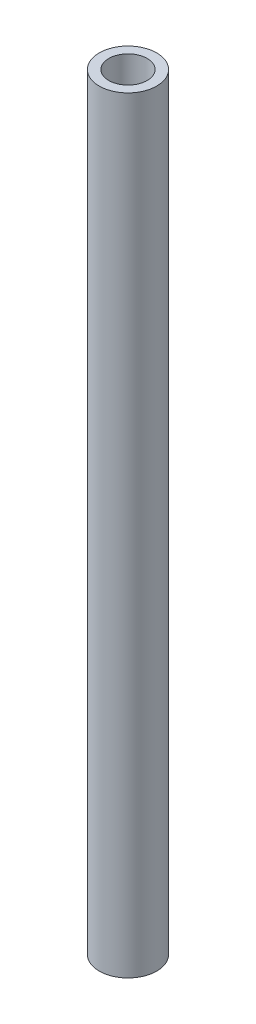
ISO-10303-21;
HEADER;
FILE_DESCRIPTION(('STEP AP214'),'2;1');
FILE_NAME('part.step','',(''),(''),'','','');
FILE_SCHEMA(('AUTOMOTIVE_DESIGN { 1 0 10303 214 1 1 1 1 }'));
ENDSEC;
DATA;
#1=APPLICATION_CONTEXT('core data for automotive mechanical design processes');
#2=APPLICATION_PROTOCOL_DEFINITION('international standard','automotive_design',2000,#1);
#3=PRODUCT_CONTEXT('',#1,'mechanical');
#4=PRODUCT('Part','Part','',(#3));
#5=PRODUCT_RELATED_PRODUCT_CATEGORY('part','',(#4));
#6=PRODUCT_DEFINITION_FORMATION('','',#4);
#7=PRODUCT_DEFINITION_CONTEXT('part definition',#1,'design');
#8=PRODUCT_DEFINITION('design','',#6,#7);
#9=PRODUCT_DEFINITION_SHAPE('','',#8);
#10=(LENGTH_UNIT() NAMED_UNIT(*) SI_UNIT(.MILLI.,.METRE.));
#11=(NAMED_UNIT(*) PLANE_ANGLE_UNIT() SI_UNIT($,.RADIAN.));
#12=(NAMED_UNIT(*) SI_UNIT($,.STERADIAN.) SOLID_ANGLE_UNIT());
#13=UNCERTAINTY_MEASURE_WITH_UNIT(LENGTH_MEASURE(1.E-05),#10,'distance_accuracy_value','');
#14=(GEOMETRIC_REPRESENTATION_CONTEXT(3) GLOBAL_UNCERTAINTY_ASSIGNED_CONTEXT((#13)) GLOBAL_UNIT_ASSIGNED_CONTEXT((#10,
#11,#12)) REPRESENTATION_CONTEXT('',''));
#15=CARTESIAN_POINT('',(0.,0.,0.));
#16=DIRECTION('',(0.,0.,1.));
#17=DIRECTION('',(1.,0.,0.));
#18=AXIS2_PLACEMENT_3D('',#15,#16,#17);
#19=CARTESIAN_POINT('',(0.,101.6,0.));
#20=DIRECTION('',(0.,1.,0.));
#21=DIRECTION('',(0.,0.,1.));
#22=AXIS2_PLACEMENT_3D('',#19,#20,#21);
#23=PLANE('',#22);
#24=CARTESIAN_POINT('',(0.,101.6,0.));
#25=DIRECTION('',(0.,1.,0.));
#26=DIRECTION('',(0.,0.,1.));
#27=AXIS2_PLACEMENT_3D('',#24,#25,#26);
#28=CIRCLE('',#27,3.81);
#29=CARTESIAN_POINT('',(0.,101.6,3.81));
#30=VERTEX_POINT('',#29);
#31=EDGE_CURVE('E10',#30,#30,#28,.T.);
#32=ORIENTED_EDGE('',*,*,#31,.T.);
#33=EDGE_LOOP('',(#32));
#34=FACE_BOUND('',#33,.T.);
#35=CARTESIAN_POINT('',(0.,101.6,0.));
#36=DIRECTION('',(0.,1.,0.));
#37=DIRECTION('',(0.,0.,1.));
#38=AXIS2_PLACEMENT_3D('',#35,#36,#37);
#39=CIRCLE('',#38,2.54);
#40=CARTESIAN_POINT('',(0.,101.6,2.54));
#41=VERTEX_POINT('',#40);
#42=EDGE_CURVE('E56',#41,#41,#39,.T.);
#43=ORIENTED_EDGE('',*,*,#42,.F.);
#44=EDGE_LOOP('',(#43));
#45=FACE_BOUND('',#44,.T.);
#46=ADVANCED_FACE('F43',(#34,#45),#23,.T.);
#47=CARTESIAN_POINT('',(0.,0.,0.));
#48=DIRECTION('',(0.,1.,0.));
#49=DIRECTION('',(0.,0.,1.));
#50=AXIS2_PLACEMENT_3D('',#47,#48,#49);
#51=PLANE('',#50);
#52=CARTESIAN_POINT('',(0.,0.,0.));
#53=DIRECTION('',(0.,1.,0.));
#54=DIRECTION('',(0.,0.,1.));
#55=AXIS2_PLACEMENT_3D('',#52,#53,#54);
#56=CIRCLE('',#55,3.81);
#57=CARTESIAN_POINT('',(0.,0.,3.81));
#58=VERTEX_POINT('',#57);
#59=EDGE_CURVE('E47',#58,#58,#56,.T.);
#60=ORIENTED_EDGE('',*,*,#59,.F.);
#61=EDGE_LOOP('',(#60));
#62=FACE_BOUND('',#61,.T.);
#63=CARTESIAN_POINT('',(0.,0.,0.));
#64=DIRECTION('',(0.,1.,0.));
#65=DIRECTION('',(0.,0.,1.));
#66=AXIS2_PLACEMENT_3D('',#63,#64,#65);
#67=CIRCLE('',#66,2.54);
#68=CARTESIAN_POINT('',(0.,0.,2.54));
#69=VERTEX_POINT('',#68);
#70=EDGE_CURVE('E58',#69,#69,#67,.T.);
#71=ORIENTED_EDGE('',*,*,#70,.T.);
#72=EDGE_LOOP('',(#71));
#73=FACE_BOUND('',#72,.T.);
#74=ADVANCED_FACE('F70',(#62,#73),#51,.F.);
#75=CARTESIAN_POINT('',(0.,101.6,0.));
#76=DIRECTION('',(0.,-1.,0.));
#77=DIRECTION('',(0.,0.,-1.));
#78=AXIS2_PLACEMENT_3D('',#75,#76,#77);
#79=CYLINDRICAL_SURFACE('',#78,3.81);
#80=ORIENTED_EDGE('',*,*,#31,.F.);
#81=EDGE_LOOP('',(#80));
#82=FACE_BOUND('',#81,.T.);
#83=ORIENTED_EDGE('',*,*,#59,.T.);
#84=EDGE_LOOP('',(#83));
#85=FACE_BOUND('',#84,.T.);
#86=ADVANCED_FACE('F45',(#82,#85),#79,.T.);
#87=CARTESIAN_POINT('',(0.,101.6,0.));
#88=DIRECTION('',(0.,-1.,0.));
#89=DIRECTION('',(0.,0.,-1.));
#90=AXIS2_PLACEMENT_3D('',#87,#88,#89);
#91=CYLINDRICAL_SURFACE('',#90,2.54);
#92=ORIENTED_EDGE('',*,*,#42,.T.);
#93=EDGE_LOOP('',(#92));
#94=FACE_BOUND('',#93,.T.);
#95=ORIENTED_EDGE('',*,*,#70,.F.);
#96=EDGE_LOOP('',(#95));
#97=FACE_BOUND('',#96,.T.);
#98=ADVANCED_FACE('F66',(#94,#97),#91,.F.);
#99=CLOSED_SHELL('',(#46,#74,#86,#98));
#100=MANIFOLD_SOLID_BREP('B2',#99);
#101=ADVANCED_BREP_SHAPE_REPRESENTATION('',(#18,#100),#14);
#102=SHAPE_DEFINITION_REPRESENTATION(#9,#101);
ENDSEC;
END-ISO-10303-21;
